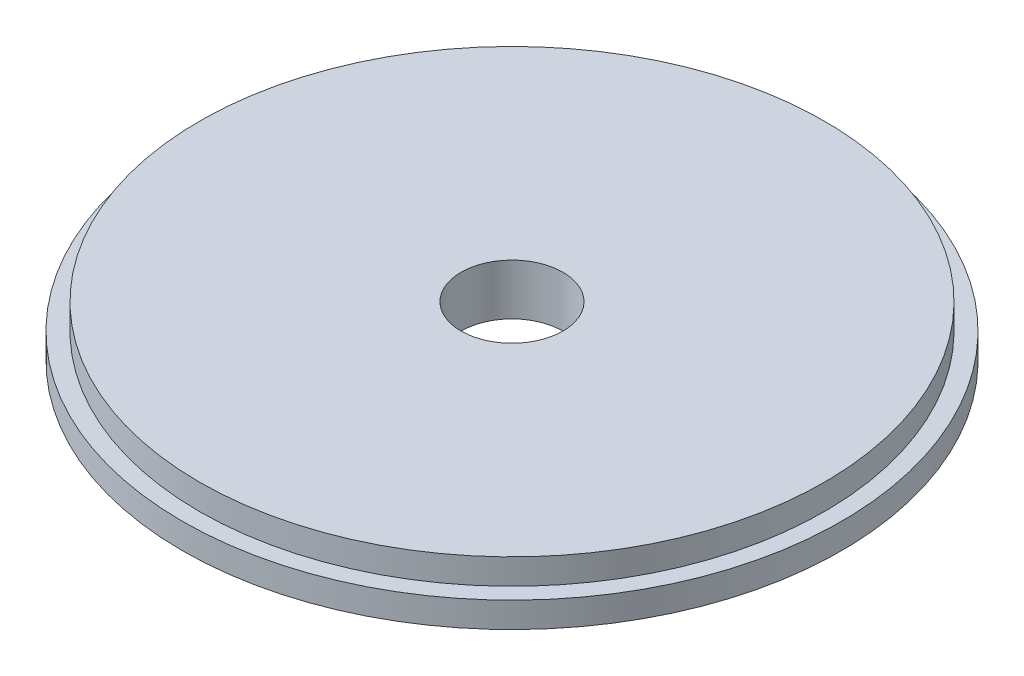
ISO-10303-21;
HEADER;
FILE_DESCRIPTION(('STEP AP214'),'2;1');
FILE_NAME('part.step','',(''),(''),'','','');
FILE_SCHEMA(('AUTOMOTIVE_DESIGN { 1 0 10303 214 1 1 1 1 }'));
ENDSEC;
DATA;
#1=APPLICATION_CONTEXT('core data for automotive mechanical design processes');
#2=APPLICATION_PROTOCOL_DEFINITION('international standard','automotive_design',2000,#1);
#3=PRODUCT_CONTEXT('',#1,'mechanical');
#4=PRODUCT('Part','Part','',(#3));
#5=PRODUCT_RELATED_PRODUCT_CATEGORY('part','',(#4));
#6=PRODUCT_DEFINITION_FORMATION('','',#4);
#7=PRODUCT_DEFINITION_CONTEXT('part definition',#1,'design');
#8=PRODUCT_DEFINITION('design','',#6,#7);
#9=PRODUCT_DEFINITION_SHAPE('','',#8);
#10=(LENGTH_UNIT() NAMED_UNIT(*) SI_UNIT(.MILLI.,.METRE.));
#11=(NAMED_UNIT(*) PLANE_ANGLE_UNIT() SI_UNIT($,.RADIAN.));
#12=(NAMED_UNIT(*) SI_UNIT($,.STERADIAN.) SOLID_ANGLE_UNIT());
#13=UNCERTAINTY_MEASURE_WITH_UNIT(LENGTH_MEASURE(1.E-05),#10,'distance_accuracy_value','');
#14=(GEOMETRIC_REPRESENTATION_CONTEXT(3) GLOBAL_UNCERTAINTY_ASSIGNED_CONTEXT((#13)) GLOBAL_UNIT_ASSIGNED_CONTEXT((#10,
#11,#12)) REPRESENTATION_CONTEXT('',''));
#15=CARTESIAN_POINT('',(0.,0.,0.));
#16=DIRECTION('',(0.,0.,1.));
#17=DIRECTION('',(1.,0.,0.));
#18=AXIS2_PLACEMENT_3D('',#15,#16,#17);
#19=CARTESIAN_POINT('',(0.,1.5,0.));
#20=DIRECTION('',(0.,-1.,0.));
#21=DIRECTION('',(0.,0.,-1.));
#22=AXIS2_PLACEMENT_3D('',#19,#20,#21);
#23=CYLINDRICAL_SURFACE('',#22,19.4);
#24=CARTESIAN_POINT('',(0.,1.5,0.));
#25=DIRECTION('',(0.,1.,0.));
#26=DIRECTION('',(0.,0.,1.));
#27=AXIS2_PLACEMENT_3D('',#24,#25,#26);
#28=CIRCLE('',#27,19.4);
#29=CARTESIAN_POINT('',(0.,1.5,19.4));
#30=VERTEX_POINT('',#29);
#31=EDGE_CURVE('E39',#30,#30,#28,.T.);
#32=ORIENTED_EDGE('',*,*,#31,.F.);
#33=EDGE_LOOP('',(#32));
#34=FACE_BOUND('',#33,.T.);
#35=CARTESIAN_POINT('',(0.,0.,0.));
#36=DIRECTION('',(0.,1.,0.));
#37=DIRECTION('',(0.,0.,1.));
#38=AXIS2_PLACEMENT_3D('',#35,#36,#37);
#39=CIRCLE('',#38,19.4);
#40=CARTESIAN_POINT('',(0.,0.,19.4));
#41=VERTEX_POINT('',#40);
#42=EDGE_CURVE('E35',#41,#41,#39,.T.);
#43=ORIENTED_EDGE('',*,*,#42,.T.);
#44=EDGE_LOOP('',(#43));
#45=FACE_BOUND('',#44,.T.);
#46=ADVANCED_FACE('F32',(#34,#45),#23,.T.);
#47=CARTESIAN_POINT('',(0.,1.5,0.));
#48=DIRECTION('',(0.,1.,0.));
#49=DIRECTION('',(0.,0.,1.));
#50=AXIS2_PLACEMENT_3D('',#47,#48,#49);
#51=PLANE('',#50);
#52=CARTESIAN_POINT('',(0.,1.5,0.));
#53=DIRECTION('',(0.,1.,0.));
#54=DIRECTION('',(0.,0.,1.));
#55=AXIS2_PLACEMENT_3D('',#52,#53,#54);
#56=CIRCLE('',#55,18.4);
#57=CARTESIAN_POINT('',(0.,1.5,18.4));
#58=VERTEX_POINT('',#57);
#59=EDGE_CURVE('E10',#58,#58,#56,.T.);
#60=ORIENTED_EDGE('',*,*,#59,.F.);
#61=EDGE_LOOP('',(#60));
#62=FACE_BOUND('',#61,.T.);
#63=ORIENTED_EDGE('',*,*,#31,.T.);
#64=EDGE_LOOP('',(#63));
#65=FACE_BOUND('',#64,.T.);
#66=ADVANCED_FACE('F76',(#62,#65),#51,.T.);
#67=CARTESIAN_POINT('',(0.,0.,0.));
#68=DIRECTION('',(0.,1.,0.));
#69=DIRECTION('',(0.,0.,1.));
#70=AXIS2_PLACEMENT_3D('',#67,#68,#69);
#71=PLANE('',#70);
#72=CARTESIAN_POINT('',(0.,0.,0.));
#73=DIRECTION('',(0.,1.,0.));
#74=DIRECTION('',(0.,0.,1.));
#75=AXIS2_PLACEMENT_3D('',#72,#73,#74);
#76=CIRCLE('',#75,3.);
#77=CARTESIAN_POINT('',(0.,0.,3.));
#78=VERTEX_POINT('',#77);
#79=EDGE_CURVE('E48',#78,#78,#76,.T.);
#80=ORIENTED_EDGE('',*,*,#79,.T.);
#81=EDGE_LOOP('',(#80));
#82=FACE_BOUND('',#81,.T.);
#83=ORIENTED_EDGE('',*,*,#42,.F.);
#84=EDGE_LOOP('',(#83));
#85=FACE_BOUND('',#84,.T.);
#86=ADVANCED_FACE('F55',(#82,#85),#71,.F.);
#87=CARTESIAN_POINT('',(0.,3.,0.));
#88=DIRECTION('',(0.,-1.,0.));
#89=DIRECTION('',(0.,0.,-1.));
#90=AXIS2_PLACEMENT_3D('',#87,#88,#89);
#91=CYLINDRICAL_SURFACE('',#90,18.4);
#92=CARTESIAN_POINT('',(0.,3.,0.));
#93=DIRECTION('',(0.,1.,0.));
#94=DIRECTION('',(0.,0.,1.));
#95=AXIS2_PLACEMENT_3D('',#92,#93,#94);
#96=CIRCLE('',#95,18.4);
#97=CARTESIAN_POINT('',(0.,3.,18.4));
#98=VERTEX_POINT('',#97);
#99=EDGE_CURVE('E45',#98,#98,#96,.T.);
#100=ORIENTED_EDGE('',*,*,#99,.F.);
#101=EDGE_LOOP('',(#100));
#102=FACE_BOUND('',#101,.T.);
#103=ORIENTED_EDGE('',*,*,#59,.T.);
#104=EDGE_LOOP('',(#103));
#105=FACE_BOUND('',#104,.T.);
#106=ADVANCED_FACE('F67',(#102,#105),#91,.T.);
#107=CARTESIAN_POINT('',(0.,3.,0.));
#108=DIRECTION('',(0.,1.,0.));
#109=DIRECTION('',(0.,0.,1.));
#110=AXIS2_PLACEMENT_3D('',#107,#108,#109);
#111=PLANE('',#110);
#112=CARTESIAN_POINT('',(0.,3.,0.));
#113=DIRECTION('',(0.,1.,0.));
#114=DIRECTION('',(0.,0.,1.));
#115=AXIS2_PLACEMENT_3D('',#112,#113,#114);
#116=CIRCLE('',#115,3.);
#117=CARTESIAN_POINT('',(0.,3.,3.));
#118=VERTEX_POINT('',#117);
#119=EDGE_CURVE('E49',#118,#118,#116,.T.);
#120=ORIENTED_EDGE('',*,*,#119,.F.);
#121=EDGE_LOOP('',(#120));
#122=FACE_BOUND('',#121,.T.);
#123=ORIENTED_EDGE('',*,*,#99,.T.);
#124=EDGE_LOOP('',(#123));
#125=FACE_BOUND('',#124,.T.);
#126=ADVANCED_FACE('F61',(#122,#125),#111,.T.);
#127=CARTESIAN_POINT('',(0.,0.,0.));
#128=DIRECTION('',(0.,1.,0.));
#129=DIRECTION('',(0.,0.,1.));
#130=AXIS2_PLACEMENT_3D('',#127,#128,#129);
#131=CYLINDRICAL_SURFACE('',#130,3.);
#132=ORIENTED_EDGE('',*,*,#79,.F.);
#133=EDGE_LOOP('',(#132));
#134=FACE_BOUND('',#133,.T.);
#135=ORIENTED_EDGE('',*,*,#119,.T.);
#136=EDGE_LOOP('',(#135));
#137=FACE_BOUND('',#136,.T.);
#138=ADVANCED_FACE('F58',(#134,#137),#131,.F.);
#139=CLOSED_SHELL('',(#46,#66,#86,#106,#126,#138));
#140=MANIFOLD_SOLID_BREP('B2',#139);
#141=ADVANCED_BREP_SHAPE_REPRESENTATION('',(#18,#140),#14);
#142=SHAPE_DEFINITION_REPRESENTATION(#9,#141);
ENDSEC;
END-ISO-10303-21;
